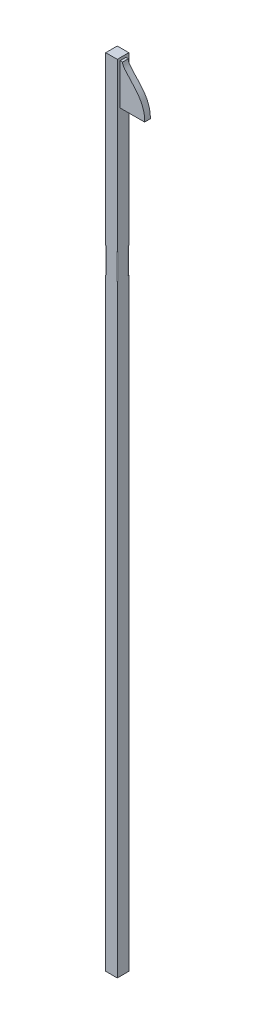
ISO-10303-21;
HEADER;
FILE_DESCRIPTION(('STEP AP214'),'2;1');
FILE_NAME('part.step','',(''),(''),'','','');
FILE_SCHEMA(('AUTOMOTIVE_DESIGN { 1 0 10303 214 1 1 1 1 }'));
ENDSEC;
DATA;
#1=APPLICATION_CONTEXT('core data for automotive mechanical design processes');
#2=APPLICATION_PROTOCOL_DEFINITION('international standard','automotive_design',2000,#1);
#3=PRODUCT_CONTEXT('',#1,'mechanical');
#4=PRODUCT('Part','Part','',(#3));
#5=PRODUCT_RELATED_PRODUCT_CATEGORY('part','',(#4));
#6=PRODUCT_DEFINITION_FORMATION('','',#4);
#7=PRODUCT_DEFINITION_CONTEXT('part definition',#1,'design');
#8=PRODUCT_DEFINITION('design','',#6,#7);
#9=PRODUCT_DEFINITION_SHAPE('','',#8);
#10=(LENGTH_UNIT() NAMED_UNIT(*) SI_UNIT(.MILLI.,.METRE.));
#11=(NAMED_UNIT(*) PLANE_ANGLE_UNIT() SI_UNIT($,.RADIAN.));
#12=(NAMED_UNIT(*) SI_UNIT($,.STERADIAN.) SOLID_ANGLE_UNIT());
#13=UNCERTAINTY_MEASURE_WITH_UNIT(LENGTH_MEASURE(1.E-05),#10,'distance_accuracy_value','');
#14=(GEOMETRIC_REPRESENTATION_CONTEXT(3) GLOBAL_UNCERTAINTY_ASSIGNED_CONTEXT((#13)) GLOBAL_UNIT_ASSIGNED_CONTEXT((#10,
#11,#12)) REPRESENTATION_CONTEXT('',''));
#15=CARTESIAN_POINT('',(0.,0.,0.));
#16=DIRECTION('',(0.,0.,1.));
#17=DIRECTION('',(1.,0.,0.));
#18=AXIS2_PLACEMENT_3D('',#15,#16,#17);
#19=CARTESIAN_POINT('',(0.85,2.9,0.110173502610086));
#20=DIRECTION('',(0.,0.,1.));
#21=DIRECTION('',(1.,0.,0.));
#22=AXIS2_PLACEMENT_3D('',#19,#20,#21);
#23=PLANE('',#22);
#24=DIRECTION('',(0.,1.,0.));
#25=VECTOR('',#24,1.);
#26=CARTESIAN_POINT('',(-0.85,2.9,0.110173502610086));
#27=LINE('',#26,#25);
#28=CARTESIAN_POINT('',(-0.85,2.9,0.110173502610086));
#29=VERTEX_POINT('',#28);
#30=CARTESIAN_POINT('',(-0.85,1.3,0.110173502610086));
#31=VERTEX_POINT('',#30);
#32=EDGE_CURVE('E374',#29,#31,#27,.F.);
#33=ORIENTED_EDGE('',*,*,#32,.T.);
#34=DIRECTION('',(1.,0.,0.));
#35=VECTOR('',#34,1.);
#36=CARTESIAN_POINT('',(0.85,1.3,0.110173502610086));
#37=LINE('',#36,#35);
#38=CARTESIAN_POINT('',(0.100899125819202,1.3,0.110173502610086));
#39=VERTEX_POINT('',#38);
#40=EDGE_CURVE('E120',#31,#39,#37,.T.);
#41=ORIENTED_EDGE('',*,*,#40,.T.);
#42=CARTESIAN_POINT('',(0.100899125819202,1.3,0.110173502610086));
#43=CARTESIAN_POINT('',(0.102305388720881,1.33336664785438,0.110173502610086));
#44=CARTESIAN_POINT('',(0.102418694779131,1.36680886901703,0.110173502610086));
#45=CARTESIAN_POINT('',(0.0999441349723264,1.43359452577916,0.110173502610086));
#46=CARTESIAN_POINT('',(0.0973560285746366,1.46693795231688,0.110173502610086));
#47=CARTESIAN_POINT('',(0.0913625702794557,1.51667671783272,0.110173502610086));
#48=CARTESIAN_POINT('',(0.0890139267344011,1.53320514328243,0.110173502610086));
#49=CARTESIAN_POINT('',(0.0808969176944397,1.58264962736257,0.110173502610086));
#50=CARTESIAN_POINT('',(0.0740592947542509,1.61540116301702,0.110173502610086));
#51=CARTESIAN_POINT('',(0.0616944121890046,1.6639567306135,0.110173502610086));
#52=CARTESIAN_POINT('',(0.0572233174207547,1.68004107962327,0.110173502610086));
#53=CARTESIAN_POINT('',(0.0427627455997351,1.7280129461602,0.110173502610086));
#54=CARTESIAN_POINT('',(0.0317306476339805,1.75959698698543,0.110173502610086));
#55=CARTESIAN_POINT('',(0.0132529566494027,1.80616996195067,0.110173502610086));
#56=CARTESIAN_POINT('',(0.00677475626660361,1.82155516242638,0.110173502610086));
#57=CARTESIAN_POINT('',(-0.0135926990462641,1.86732464783749,0.110173502610086));
#58=CARTESIAN_POINT('',(-0.0284086316945955,1.8973052543125,0.110173502610086));
#59=CARTESIAN_POINT('',(-0.0522417618238263,1.94137092062321,0.110173502610086));
#60=CARTESIAN_POINT('',(-0.0604516146934541,1.95590433872499,0.110173502610086));
#61=CARTESIAN_POINT('',(-0.0858380552811515,1.99908035238795,0.110173502610086));
#62=CARTESIAN_POINT('',(-0.103765796694549,2.02728721213659,0.110173502610086));
#63=CARTESIAN_POINT('',(-0.131879912365411,2.06874054639115,0.110173502610086));
#64=CARTESIAN_POINT('',(-0.141452782521934,2.08241256939298,0.110173502610086));
#65=CARTESIAN_POINT('',(-0.170727458499587,2.12304017394233,0.110173502610086));
#66=CARTESIAN_POINT('',(-0.190981428902999,2.14960120830227,0.110173502610086));
#67=CARTESIAN_POINT('',(-0.222203736617376,2.18875351332272,0.110173502610086));
#68=CARTESIAN_POINT('',(-0.232749937926459,2.20168773121554,0.110173502610086));
#69=CARTESIAN_POINT('',(-0.264756841972034,2.24018966679057,0.110173502610086));
#70=CARTESIAN_POINT('',(-0.2865839325908,2.26545417980147,0.110173502610086));
#71=CARTESIAN_POINT('',(-0.319829475260694,2.30289299860136,0.110173502610086));
#72=CARTESIAN_POINT('',(-0.330994744375275,2.31529550188057,0.110173502610086));
#73=CARTESIAN_POINT('',(-0.364693407076319,2.35231949580681,0.110173502610086));
#74=CARTESIAN_POINT('',(-0.387429210186716,2.3767569586789,0.110173502610086));
#75=CARTESIAN_POINT('',(-0.421717662040299,2.4132360151299,0.110173502610086));
#76=CARTESIAN_POINT('',(-0.433177714835523,2.42536594587241,0.110173502610086));
#77=CARTESIAN_POINT('',(-0.467593817594204,2.4617219218368,0.110173502610086));
#78=CARTESIAN_POINT('',(-0.490585853825393,2.48591419540268,0.110173502610086));
#79=CARTESIAN_POINT('',(-0.524858734691096,2.52240557150338,0.110173502610086));
#80=CARTESIAN_POINT('',(-0.536247207118072,2.53460323591972,0.110173502610086));
#81=CARTESIAN_POINT('',(-0.558887523112638,2.55912550072514,0.110173502610086));
#82=CARTESIAN_POINT('',(-0.570139364694187,2.57145010295456,0.110173502610086));
#83=CARTESIAN_POINT('',(-0.59242639833595,2.59629527103212,0.110173502610086));
#84=CARTESIAN_POINT('',(-0.603461584018732,2.60881584262933,0.110173502610086));
#85=CARTESIAN_POINT('',(-0.625206388318713,2.6341395070912,0.110173502610086));
#86=CARTESIAN_POINT('',(-0.635915987967142,2.64694261634189,0.110173502610086));
#87=CARTESIAN_POINT('',(-0.656855022983628,2.67294201586249,0.110173502610086));
#88=CARTESIAN_POINT('',(-0.66708440131718,2.68613835253214,0.110173502610086));
#89=CARTESIAN_POINT('',(-0.686194204559783,2.71221239443918,0.110173502610086));
#90=CARTESIAN_POINT('',(-0.695119038562995,2.72505717687144,0.110173502610086));
#91=CARTESIAN_POINT('',(-0.711994978172597,2.75135000389626,0.110173502610086));
#92=CARTESIAN_POINT('',(-0.719947905027828,2.76479685357322,0.110173502610086));
#93=CARTESIAN_POINT('',(-0.733093287295084,2.79016469910344,0.110173502610086));
#94=CARTESIAN_POINT('',(-0.738525174385424,2.801956944667,0.110173502610086));
#95=CARTESIAN_POINT('',(-0.746558467960461,2.82320508808608,0.110173502610086));
#96=CARTESIAN_POINT('',(-0.749527609011546,2.83251863412376,0.110173502610086));
#97=CARTESIAN_POINT('',(-0.75403889188897,2.85146190462698,0.110173502610086));
#98=CARTESIAN_POINT('',(-0.755589637744402,2.86108935081317,0.110173502610086));
#99=CARTESIAN_POINT('',(-0.756386936933705,2.87564412215255,0.110173502610086));
#100=CARTESIAN_POINT('',(-0.756395916592759,2.88052748207427,0.110173502610086));
#101=CARTESIAN_POINT('',(-0.755812315266143,2.89029191549379,0.110173502610086));
#102=CARTESIAN_POINT('',(-0.755215362109504,2.89517271447045,0.110173502610086));
#103=CARTESIAN_POINT('',(-0.754271379437274,2.9,0.110173502610086));
#104=B_SPLINE_CURVE_WITH_KNOTS('',3,(#42,#43,#44,#45,#46,#47,#48,#49,#50,#51,#52,#53,#54,#55,
#56,#57,#58,#59,#60,#61,#62,#63,#64,#65,#66,#67,#68,#69,#70,#71,#72,#73,#74,#75,#76,#77,#78,#79,
#80,#81,#82,#83,#84,#85,#86,#87,#88,#89,#90,#91,#92,#93,#94,#95,#96,#97,#98,#99,#100,#101,#102,
#103),.UNSPECIFIED.,.F.,.F.,(4,2,2,2,2,2,2,2,2,2,2,2,2,2,2,2,2,2,2,2,2,2,2,2,2,2,2,2,2,2,4),(0.,
0.100200608489576,0.200410139560578,0.250483749098557,0.350702153848327,0.400776181940032,
0.500992367302773,0.551065205368039,0.651266580602867,0.701336957582731,0.801516162637446,
0.851583622993298,0.951740194370672,1.00180515193273,1.10194447148951,1.15200773379046,
1.25213629434438,1.30219864751873,1.40232317027707,1.45238579602033,1.50244914859546,
1.55251397262122,1.6025817078754,1.65265537456417,1.69955139429332,1.7463581427431,
1.78521494818375,1.81447416063349,1.84355468538391,1.85817109277964,1.87289372138671),.UNSPECIFIED.);
#105=CARTESIAN_POINT('',(-0.754271379437274,2.9,0.110173502610086));
#106=VERTEX_POINT('',#105);
#107=EDGE_CURVE('E24',#39,#106,#104,.T.);
#108=ORIENTED_EDGE('',*,*,#107,.T.);
#109=DIRECTION('',(1.,0.,0.));
#110=VECTOR('',#109,1.);
#111=CARTESIAN_POINT('',(0.85,2.9,0.110173502610086));
#112=LINE('',#111,#110);
#113=EDGE_CURVE('E377',#106,#29,#112,.F.);
#114=ORIENTED_EDGE('',*,*,#113,.T.);
#115=EDGE_LOOP('',(#33,#41,#108,#114));
#116=FACE_BOUND('',#115,.T.);
#117=ADVANCED_FACE('F17',(#116),#23,.T.);
#118=CARTESIAN_POINT('',(0.100899125819202,1.3,0.110173502610086));
#119=CARTESIAN_POINT('',(0.100899125819202,1.3,-0.258517350261009));
#120=CARTESIAN_POINT('',(0.102161316913395,1.33018182743931,0.110173502610086));
#121=CARTESIAN_POINT('',(0.102161316913395,1.33018182743931,-0.258517350261009));
#122=CARTESIAN_POINT('',(0.102928931664183,1.39013939139415,0.110173502610086));
#123=CARTESIAN_POINT('',(0.102928931664183,1.39013939139415,-0.258517350261009));
#124=CARTESIAN_POINT('',(0.0988101809346095,1.47885746966527,0.110173502610086));
#125=CARTESIAN_POINT('',(0.0988101809346095,1.47885746966527,-0.258517350261009));
#126=CARTESIAN_POINT('',(0.0827004100197384,1.59469395369209,0.110173502610086));
#127=CARTESIAN_POINT('',(0.0827004100197384,1.59469395369209,-0.258517350261009));
#128=CARTESIAN_POINT('',(0.0446474719014038,1.7352418345057,0.110173502610086));
#129=CARTESIAN_POINT('',(0.0446474719014038,1.7352418345057,-0.258517350261009));
#130=CARTESIAN_POINT('',(-0.0111822678173812,1.87125590361862,0.110173502610086));
#131=CARTESIAN_POINT('',(-0.0111822678173812,1.87125590361862,-0.258517350261009));
#132=CARTESIAN_POINT('',(-0.083811744606569,2.00231200075987,0.110173502610086));
#133=CARTESIAN_POINT('',(-0.083811744606569,2.00231200075987,-0.258517350261009));
#134=CARTESIAN_POINT('',(-0.170985439766142,2.1278493463251,0.110173502610086));
#135=CARTESIAN_POINT('',(-0.170985439766142,2.1278493463251,-0.258517350261009));
#136=CARTESIAN_POINT('',(-0.268406549547145,2.24717531020337,0.110173502610086));
#137=CARTESIAN_POINT('',(-0.268406549547145,2.24717531020337,-0.258517350261009));
#138=CARTESIAN_POINT('',(-0.370218593172325,2.35951057822847,0.110173502610086));
#139=CARTESIAN_POINT('',(-0.370218593172325,2.35951057822847,-0.258517350261009));
#140=CARTESIAN_POINT('',(-0.469917194208403,2.46405442724653,0.110173502610086));
#141=CARTESIAN_POINT('',(-0.469917194208403,2.46405442724653,-0.258517350261009));
#142=CARTESIAN_POINT('',(-0.561118331093695,2.56007299012793,0.110173502610086));
#143=CARTESIAN_POINT('',(-0.561118331093695,2.56007299012793,-0.258517350261009));
#144=CARTESIAN_POINT('',(-0.638294458126951,2.64698716653611,0.110173502610086));
#145=CARTESIAN_POINT('',(-0.638294458126951,2.64698716653611,-0.258517350261009));
#146=CARTESIAN_POINT('',(-0.697785468714333,2.7245390714351,0.110173502610086));
#147=CARTESIAN_POINT('',(-0.697785468714333,2.7245390714351,-0.258517350261009));
#148=CARTESIAN_POINT('',(-0.737966519602591,2.79279596856583,0.110173502610086));
#149=CARTESIAN_POINT('',(-0.737966519602591,2.79279596856583,-0.258517350261009));
#150=CARTESIAN_POINT('',(-0.754283259268477,2.84011903002906,0.110173502610086));
#151=CARTESIAN_POINT('',(-0.754283259268477,2.84011903002906,-0.258517350261009));
#152=CARTESIAN_POINT('',(-0.757688052822413,2.87160599650294,0.110173502610086));
#153=CARTESIAN_POINT('',(-0.757688052822413,2.87160599650294,-0.258517350261009));
#154=CARTESIAN_POINT('',(-0.756059911881393,2.89082989636708,0.110173502610086));
#155=CARTESIAN_POINT('',(-0.756059911881393,2.89082989636708,-0.258517350261009));
#156=CARTESIAN_POINT('',(-0.754271379437274,2.9,0.110173502610086));
#157=CARTESIAN_POINT('',(-0.754271379437274,2.9,-0.258517350261009));
#158=B_SPLINE_SURFACE_WITH_KNOTS('',5,1,((#118,#119),(#120,#121),(#122,#123),(#124,#125),(#126,
#127),(#128,#129),(#130,#131),(#132,#133),(#134,#135),(#136,#137),(#138,#139),(#140,#141),(#142,
#143),(#144,#145),(#146,#147),(#148,#149),(#150,#151),(#152,#153),(#154,#155),(#156,#157)),
.UNSPECIFIED.,.F.,.F.,.F.,(6,1,1,1,1,1,1,1,1,1,1,1,1,1,1,6),(2,2),(-1.,-0.933333333333333,
-0.866666666666667,-0.8,-0.733333333333333,-0.666666666666667,-0.6,-0.533333333333333,
-0.466666666666667,-0.4,-0.333333333333333,-0.266666666666667,-0.2,-0.133333333333333,
-0.0666666666666667,0.),(0.,0.0368690852871095),.UNSPECIFIED.);
#159=DIRECTION('',(0.,0.,1.));
#160=VECTOR('',#159,1.);
#161=CARTESIAN_POINT('',(-0.754271379437274,2.9,0.));
#162=LINE('',#161,#160);
#163=CARTESIAN_POINT('',(-0.754271379437274,2.9,-0.110173502610086));
#164=VERTEX_POINT('',#163);
#165=EDGE_CURVE('E364',#106,#164,#162,.F.);
#166=DIRECTION('',(0.,0.,1.));
#167=VECTOR('',#166,1.);
#168=CARTESIAN_POINT('',(0.100899125819202,1.3,-0.0741719238254615));
#169=LINE('',#168,#167);
#170=CARTESIAN_POINT('',(0.100899125819202,1.3,-0.110173502610086));
#171=VERTEX_POINT('',#170);
#172=EDGE_CURVE('E116',#171,#39,#169,.T.);
#173=CARTESIAN_POINT('',(-0.754271379437274,2.9,-0.110173502610086));
#174=CARTESIAN_POINT('',(-0.755738562220202,2.89249173443631,-0.110173502610086));
#175=CARTESIAN_POINT('',(-0.756366435973199,2.88488995845058,-0.110173502610086));
#176=CARTESIAN_POINT('',(-0.75627458467291,2.86982331678855,-0.110173502610086));
#177=CARTESIAN_POINT('',(-0.755579157935418,2.86235847524754,-0.110173502610086));
#178=CARTESIAN_POINT('',(-0.752490191383573,2.84319344869217,-0.110173502610086));
#179=CARTESIAN_POINT('',(-0.749330105717283,2.83162869515541,-0.110173502610086));
#180=CARTESIAN_POINT('',(-0.741432861887619,2.80902446481223,-0.110173502610086));
#181=CARTESIAN_POINT('',(-0.736687055506086,2.79798825646503,-0.110173502610086));
#182=CARTESIAN_POINT('',(-0.726078596809697,2.77622931337648,-0.110173502610086));
#183=CARTESIAN_POINT('',(-0.720197254209045,2.76551589083944,-0.110173502610086));
#184=CARTESIAN_POINT('',(-0.707712476927154,2.74451411326866,-0.110173502610086));
#185=CARTESIAN_POINT('',(-0.70110840193879,2.73422614646908,-0.110173502610086));
#186=CARTESIAN_POINT('',(-0.680554513315993,2.70388605566598,-0.110173502610086));
#187=CARTESIAN_POINT('',(-0.665856340107139,2.68434538981179,-0.110173502610086));
#188=CARTESIAN_POINT('',(-0.635304375180131,2.64601183174423,-0.110173502610086));
#189=CARTESIAN_POINT('',(-0.619443712540409,2.62722460530892,-0.110173502610086));
#190=CARTESIAN_POINT('',(-0.587121618690929,2.59020852091149,-0.110173502610086));
#191=CARTESIAN_POINT('',(-0.570660770690057,2.57197915097567,-0.110173502610086));
#192=CARTESIAN_POINT('',(-0.521532015027294,2.51851242616434,-0.110173502610086));
#193=CARTESIAN_POINT('',(-0.488423139803536,2.48368622554896,-0.110173502610086));
#194=CARTESIAN_POINT('',(-0.42230482492221,2.41391066795704,-0.110173502610086));
#195=CARTESIAN_POINT('',(-0.389295437794886,2.37896126184945,-0.110173502610086));
#196=CARTESIAN_POINT('',(-0.324430453166217,2.30832589379311,-0.110173502610086));
#197=CARTESIAN_POINT('',(-0.292569779695282,2.27264466478911,-0.110173502610086));
#198=CARTESIAN_POINT('',(-0.230672337684236,2.19972823314143,-0.110173502610086));
#199=CARTESIAN_POINT('',(-0.20063494993332,2.16249356539609,-0.110173502610086));
#200=CARTESIAN_POINT('',(-0.14938369501497,2.09404372010623,-0.110173502610086));
#201=CARTESIAN_POINT('',(-0.12764789128393,2.06322250906079,-0.110173502610086));
#202=CARTESIAN_POINT('',(-0.0863951407376518,2.00011576844034,-0.110173502610086));
#203=CARTESIAN_POINT('',(-0.0668781722706048,1.96783025315858,-0.110173502610086));
#204=CARTESIAN_POINT('',(-0.0305901367360032,1.90180792510239,-0.110173502610086));
#205=CARTESIAN_POINT('',(-0.0138146490379295,1.8680735617875,-0.110173502610086));
#206=CARTESIAN_POINT('',(0.0165923227174184,1.79921883209672,-0.110173502610086));
#207=CARTESIAN_POINT('',(0.0302247606477213,1.76409889002458,-0.110173502610086));
#208=CARTESIAN_POINT('',(0.0535111150029728,1.69427168287703,-0.110173502610086));
#209=CARTESIAN_POINT('',(0.0633134166073864,1.65961398541499,-0.110173502610086));
#210=CARTESIAN_POINT('',(0.0796278683591426,1.58952107377571,-0.110173502610086));
#211=CARTESIAN_POINT('',(0.0861390368587591,1.55408563090456,-0.110173502610086));
#212=CARTESIAN_POINT('',(0.0959398717285155,1.48226567132045,-0.110173502610086));
#213=CARTESIAN_POINT('',(0.0991825451503164,1.44587482187644,-0.110173502610086));
#214=CARTESIAN_POINT('',(0.102430114735557,1.3729621553975,-0.110173502610086));
#215=CARTESIAN_POINT('',(0.102436394494413,1.33644040100379,-0.110173502610086));
#216=CARTESIAN_POINT('',(0.100899125819202,1.3,-0.110173502610086));
#217=B_SPLINE_CURVE_WITH_KNOTS('',3,(#173,#174,#175,#176,#177,#178,#179,#180,#181,#182,#183,
#184,#185,#186,#187,#188,#189,#190,#191,#192,#193,#194,#195,#196,#197,#198,#199,#200,#201,#202,
#203,#204,#205,#206,#207,#208,#209,#210,#211,#212,#213,#214,#215,#216),.UNSPECIFIED.,.F.,.F.,(4,
2,2,2,2,2,2,2,2,2,2,2,2,2,2,2,2,2,2,2,2,4),(0.,0.0228046987879947,0.0451946964399197,
0.0809677534452651,0.116939183985038,0.153562845128505,0.19021921989779,0.263490047325081,
0.33723564661994,0.410911402160929,0.555063719281688,0.699282106709919,0.84275609492547,
0.986181081763543,1.09924961428031,1.21231704335847,1.32520031307129,1.43804927901276,
1.54594414873212,1.65387118133957,1.76332870899933,1.87273944227156),.UNSPECIFIED.);
#218=EDGE_CURVE('E319',#164,#171,#217,.T.);
#219=ORIENTED_EDGE('',*,*,#165,.F.);
#220=ORIENTED_EDGE('',*,*,#107,.F.);
#221=ORIENTED_EDGE('',*,*,#172,.F.);
#222=ORIENTED_EDGE('',*,*,#218,.F.);
#223=EDGE_LOOP('',(#219,#220,#221,#222));
#224=FACE_BOUND('',#223,.T.);
#225=ADVANCED_FACE('F19',(#224),#158,.F.);
#226=CARTESIAN_POINT('',(0.,-3.5,0.));
#227=DIRECTION('',(0.,-1.,0.));
#228=DIRECTION('',(0.,0.,-1.));
#229=AXIS2_PLACEMENT_3D('',#226,#227,#228);
#230=PLANE('',#229);
#231=DIRECTION('',(0.,0.,-1.));
#232=VECTOR('',#231,1.);
#233=CARTESIAN_POINT('',(-0.85,-3.5,0.225));
#234=LINE('',#233,#232);
#235=CARTESIAN_POINT('',(-0.85,-3.5,0.225));
#236=VERTEX_POINT('',#235);
#237=CARTESIAN_POINT('',(-0.85,-3.5,0.2));
#238=VERTEX_POINT('',#237);
#239=EDGE_CURVE('E336',#236,#238,#234,.T.);
#240=ORIENTED_EDGE('',*,*,#239,.F.);
#241=DIRECTION('',(1.,0.,0.));
#242=VECTOR('',#241,1.);
#243=CARTESIAN_POINT('',(-1.3,-3.5,0.225));
#244=LINE('',#243,#242);
#245=CARTESIAN_POINT('',(-0.875,-3.5,0.225));
#246=VERTEX_POINT('',#245);
#247=EDGE_CURVE('E304',#246,#236,#244,.T.);
#248=ORIENTED_EDGE('',*,*,#247,.F.);
#249=CARTESIAN_POINT('',(-0.875,-3.5,0.2));
#250=DIRECTION('',(0.,-1.,0.));
#251=DIRECTION('',(0.,0.,-1.));
#252=AXIS2_PLACEMENT_3D('',#249,#250,#251);
#253=CIRCLE('',#252,0.025);
#254=EDGE_CURVE('E504',#238,#246,#253,.T.);
#255=ORIENTED_EDGE('',*,*,#254,.F.);
#256=EDGE_LOOP('',(#240,#248,#255));
#257=FACE_BOUND('',#256,.T.);
#258=ADVANCED_FACE('F422',(#257),#230,.T.);
#259=CARTESIAN_POINT('',(-0.875,0.,0.2));
#260=DIRECTION('',(0.,-1.,0.));
#261=DIRECTION('',(0.,0.,-1.));
#262=AXIS2_PLACEMENT_3D('',#259,#260,#261);
#263=CYLINDRICAL_SURFACE('',#262,0.025);
#264=ORIENTED_EDGE('',*,*,#254,.T.);
#265=DIRECTION('',(0.,1.,0.));
#266=VECTOR('',#265,1.);
#267=CARTESIAN_POINT('',(-0.875,0.,0.225));
#268=LINE('',#267,#266);
#269=CARTESIAN_POINT('',(-0.875,-4.5,0.225));
#270=VERTEX_POINT('',#269);
#271=EDGE_CURVE('E273',#270,#246,#268,.T.);
#272=ORIENTED_EDGE('',*,*,#271,.F.);
#273=CARTESIAN_POINT('',(-0.875,-4.5,0.2));
#274=DIRECTION('',(0.,-1.,0.));
#275=DIRECTION('',(0.,0.,-1.));
#276=AXIS2_PLACEMENT_3D('',#273,#274,#275);
#277=CIRCLE('',#276,0.025);
#278=CARTESIAN_POINT('',(-0.85,-4.5,0.2));
#279=VERTEX_POINT('',#278);
#280=EDGE_CURVE('E367',#270,#279,#277,.F.);
#281=ORIENTED_EDGE('',*,*,#280,.T.);
#282=DIRECTION('',(0.,1.,0.));
#283=VECTOR('',#282,1.);
#284=CARTESIAN_POINT('',(-0.85,0.,0.2));
#285=LINE('',#284,#283);
#286=EDGE_CURVE('E331',#238,#279,#285,.F.);
#287=ORIENTED_EDGE('',*,*,#286,.F.);
#288=EDGE_LOOP('',(#264,#272,#281,#287));
#289=FACE_BOUND('',#288,.T.);
#290=ADVANCED_FACE('F418',(#289),#263,.T.);
#291=CARTESIAN_POINT('',(0.,-4.5,0.));
#292=DIRECTION('',(0.,-1.,0.));
#293=DIRECTION('',(0.,0.,-1.));
#294=AXIS2_PLACEMENT_3D('',#291,#292,#293);
#295=PLANE('',#294);
#296=DIRECTION('',(1.,0.,0.));
#297=VECTOR('',#296,1.);
#298=CARTESIAN_POINT('',(-1.3,-4.5,0.225));
#299=LINE('',#298,#297);
#300=CARTESIAN_POINT('',(-0.85,-4.5,0.225));
#301=VERTEX_POINT('',#300);
#302=EDGE_CURVE('E303',#301,#270,#299,.F.);
#303=ORIENTED_EDGE('',*,*,#302,.F.);
#304=DIRECTION('',(0.,0.,-1.));
#305=VECTOR('',#304,1.);
#306=CARTESIAN_POINT('',(-0.85,-4.5,0.225));
#307=LINE('',#306,#305);
#308=EDGE_CURVE('E312',#279,#301,#307,.F.);
#309=ORIENTED_EDGE('',*,*,#308,.F.);
#310=ORIENTED_EDGE('',*,*,#280,.F.);
#311=EDGE_LOOP('',(#303,#309,#310));
#312=FACE_BOUND('',#311,.T.);
#313=ADVANCED_FACE('F414',(#312),#295,.F.);
#314=CARTESIAN_POINT('',(0.,2.9,0.));
#315=DIRECTION('',(0.,1.,0.));
#316=DIRECTION('',(0.,0.,1.));
#317=AXIS2_PLACEMENT_3D('',#314,#315,#316);
#318=PLANE('',#317);
#319=DIRECTION('',(0.,0.,-1.));
#320=VECTOR('',#319,1.);
#321=CARTESIAN_POINT('',(-0.85,2.9,0.225));
#322=LINE('',#321,#320);
#323=CARTESIAN_POINT('',(-0.85,2.9,-0.110173502610086));
#324=VERTEX_POINT('',#323);
#325=EDGE_CURVE('E324',#29,#324,#322,.T.);
#326=ORIENTED_EDGE('',*,*,#325,.F.);
#327=ORIENTED_EDGE('',*,*,#113,.F.);
#328=ORIENTED_EDGE('',*,*,#165,.T.);
#329=DIRECTION('',(-1.,0.,0.));
#330=VECTOR('',#329,1.);
#331=CARTESIAN_POINT('',(-0.85,2.9,-0.110173502610086));
#332=LINE('',#331,#330);
#333=EDGE_CURVE('E315',#324,#164,#332,.F.);
#334=ORIENTED_EDGE('',*,*,#333,.F.);
#335=EDGE_LOOP('',(#326,#327,#328,#334));
#336=FACE_BOUND('',#335,.T.);
#337=ADVANCED_FACE('F409',(#336),#318,.T.);
#338=CARTESIAN_POINT('',(-0.85,2.9,-0.110173502610086));
#339=DIRECTION('',(0.,0.,-1.));
#340=DIRECTION('',(-1.,0.,0.));
#341=AXIS2_PLACEMENT_3D('',#338,#339,#340);
#342=PLANE('',#341);
#343=DIRECTION('',(0.,1.,0.));
#344=VECTOR('',#343,1.);
#345=CARTESIAN_POINT('',(-0.85,0.,-0.110173502610086));
#346=LINE('',#345,#344);
#347=CARTESIAN_POINT('',(-0.85,1.3,-0.110173502610086));
#348=VERTEX_POINT('',#347);
#349=EDGE_CURVE('E357',#324,#348,#346,.F.);
#350=ORIENTED_EDGE('',*,*,#349,.F.);
#351=ORIENTED_EDGE('',*,*,#333,.T.);
#352=ORIENTED_EDGE('',*,*,#218,.T.);
#353=DIRECTION('',(1.,0.,0.));
#354=VECTOR('',#353,1.);
#355=CARTESIAN_POINT('',(0.,1.3,-0.110173502610086));
#356=LINE('',#355,#354);
#357=EDGE_CURVE('E318',#348,#171,#356,.T.);
#358=ORIENTED_EDGE('',*,*,#357,.F.);
#359=EDGE_LOOP('',(#350,#351,#352,#358));
#360=FACE_BOUND('',#359,.T.);
#361=ADVANCED_FACE('F403',(#360),#342,.T.);
#362=CARTESIAN_POINT('',(0.,1.3,0.));
#363=DIRECTION('',(0.,-1.,0.));
#364=DIRECTION('',(0.,0.,-1.));
#365=AXIS2_PLACEMENT_3D('',#362,#363,#364);
#366=PLANE('',#365);
#367=DIRECTION('',(0.,0.,-1.));
#368=VECTOR('',#367,1.);
#369=CARTESIAN_POINT('',(-0.85,1.3,0.225));
#370=LINE('',#369,#368);
#371=EDGE_CURVE('E204',#348,#31,#370,.F.);
#372=ORIENTED_EDGE('',*,*,#371,.F.);
#373=ORIENTED_EDGE('',*,*,#357,.T.);
#374=ORIENTED_EDGE('',*,*,#172,.T.);
#375=ORIENTED_EDGE('',*,*,#40,.F.);
#376=EDGE_LOOP('',(#372,#373,#374,#375));
#377=FACE_BOUND('',#376,.T.);
#378=ADVANCED_FACE('F408',(#377),#366,.T.);
#379=CARTESIAN_POINT('',(0.,-3.5,0.));
#380=DIRECTION('',(0.,-1.,0.));
#381=DIRECTION('',(0.,0.,-1.));
#382=AXIS2_PLACEMENT_3D('',#379,#380,#381);
#383=PLANE('',#382);
#384=DIRECTION('',(1.,0.,0.));
#385=VECTOR('',#384,1.);
#386=CARTESIAN_POINT('',(-1.3,-3.5,0.225));
#387=LINE('',#386,#385);
#388=CARTESIAN_POINT('',(-1.3,-3.5,0.225));
#389=VERTEX_POINT('',#388);
#390=CARTESIAN_POINT('',(-1.275,-3.5,0.225));
#391=VERTEX_POINT('',#390);
#392=EDGE_CURVE('E300',#389,#391,#387,.T.);
#393=ORIENTED_EDGE('',*,*,#392,.F.);
#394=DIRECTION('',(0.,0.,1.));
#395=VECTOR('',#394,1.);
#396=CARTESIAN_POINT('',(-1.3,-3.5,-0.225));
#397=LINE('',#396,#395);
#398=CARTESIAN_POINT('',(-1.3,-3.5,0.2));
#399=VERTEX_POINT('',#398);
#400=EDGE_CURVE('E287',#399,#389,#397,.T.);
#401=ORIENTED_EDGE('',*,*,#400,.F.);
#402=CARTESIAN_POINT('',(-1.275,-3.5,0.2));
#403=DIRECTION('',(0.,1.,0.));
#404=DIRECTION('',(0.,0.,1.));
#405=AXIS2_PLACEMENT_3D('',#402,#403,#404);
#406=CIRCLE('',#405,0.025);
#407=EDGE_CURVE('E272',#391,#399,#406,.F.);
#408=ORIENTED_EDGE('',*,*,#407,.F.);
#409=EDGE_LOOP('',(#393,#401,#408));
#410=FACE_BOUND('',#409,.T.);
#411=ADVANCED_FACE('F484',(#410),#383,.T.);
#412=CARTESIAN_POINT('',(-1.3,0.,0.225));
#413=DIRECTION('',(0.,0.,1.));
#414=DIRECTION('',(1.,0.,0.));
#415=AXIS2_PLACEMENT_3D('',#412,#413,#414);
#416=PLANE('',#415);
#417=ORIENTED_EDGE('',*,*,#302,.T.);
#418=ORIENTED_EDGE('',*,*,#271,.T.);
#419=ORIENTED_EDGE('',*,*,#247,.T.);
#420=DIRECTION('',(0.,1.,0.));
#421=VECTOR('',#420,1.);
#422=CARTESIAN_POINT('',(-0.85,0.,0.225));
#423=LINE('',#422,#421);
#424=CARTESIAN_POINT('',(-0.85,3.,0.225));
#425=VERTEX_POINT('',#424);
#426=EDGE_CURVE('E241',#425,#236,#423,.F.);
#427=ORIENTED_EDGE('',*,*,#426,.F.);
#428=DIRECTION('',(1.,0.,0.));
#429=VECTOR('',#428,1.);
#430=CARTESIAN_POINT('',(-1.075,3.,0.225));
#431=LINE('',#430,#429);
#432=CARTESIAN_POINT('',(-1.3,3.,0.225));
#433=VERTEX_POINT('',#432);
#434=EDGE_CURVE('E290',#433,#425,#431,.T.);
#435=ORIENTED_EDGE('',*,*,#434,.F.);
#436=DIRECTION('',(0.,1.,0.));
#437=VECTOR('',#436,1.);
#438=CARTESIAN_POINT('',(-1.3,0.,0.225));
#439=LINE('',#438,#437);
#440=EDGE_CURVE('E256',#389,#433,#439,.T.);
#441=ORIENTED_EDGE('',*,*,#440,.F.);
#442=ORIENTED_EDGE('',*,*,#392,.T.);
#443=DIRECTION('',(0.,1.,0.));
#444=VECTOR('',#443,1.);
#445=CARTESIAN_POINT('',(-1.275,0.,0.225));
#446=LINE('',#445,#444);
#447=CARTESIAN_POINT('',(-1.275,-4.5,0.225));
#448=VERTEX_POINT('',#447);
#449=EDGE_CURVE('E293',#448,#391,#446,.T.);
#450=ORIENTED_EDGE('',*,*,#449,.F.);
#451=DIRECTION('',(1.,0.,0.));
#452=VECTOR('',#451,1.);
#453=CARTESIAN_POINT('',(0.,-4.5,0.225));
#454=LINE('',#453,#452);
#455=CARTESIAN_POINT('',(-1.3,-4.5,0.225));
#456=VERTEX_POINT('',#455);
#457=EDGE_CURVE('E270',#448,#456,#454,.F.);
#458=ORIENTED_EDGE('',*,*,#457,.T.);
#459=DIRECTION('',(0.,1.,0.));
#460=VECTOR('',#459,1.);
#461=CARTESIAN_POINT('',(-1.3,0.,0.225));
#462=LINE('',#461,#460);
#463=CARTESIAN_POINT('',(-1.3,-28.,0.225));
#464=VERTEX_POINT('',#463);
#465=EDGE_CURVE('E178',#464,#456,#462,.T.);
#466=ORIENTED_EDGE('',*,*,#465,.F.);
#467=DIRECTION('',(1.,0.,0.));
#468=VECTOR('',#467,1.);
#469=CARTESIAN_POINT('',(-1.075,-28.,0.225));
#470=LINE('',#469,#468);
#471=CARTESIAN_POINT('',(-0.85,-28.,0.225));
#472=VERTEX_POINT('',#471);
#473=EDGE_CURVE('E174',#472,#464,#470,.F.);
#474=ORIENTED_EDGE('',*,*,#473,.F.);
#475=DIRECTION('',(0.,1.,0.));
#476=VECTOR('',#475,1.);
#477=CARTESIAN_POINT('',(-0.85,0.,0.225));
#478=LINE('',#477,#476);
#479=EDGE_CURVE('E213',#301,#472,#478,.F.);
#480=ORIENTED_EDGE('',*,*,#479,.F.);
#481=EDGE_LOOP('',(#417,#418,#419,#427,#435,#441,#442,#450,#458,#466,#474,#480));
#482=FACE_BOUND('',#481,.T.);
#483=ADVANCED_FACE('F481',(#482),#416,.T.);
#484=CARTESIAN_POINT('',(0.,-4.5,0.));
#485=DIRECTION('',(0.,-1.,0.));
#486=DIRECTION('',(0.,0.,-1.));
#487=AXIS2_PLACEMENT_3D('',#484,#485,#486);
#488=PLANE('',#487);
#489=DIRECTION('',(0.,0.,1.));
#490=VECTOR('',#489,1.);
#491=CARTESIAN_POINT('',(-1.3,-4.5,-0.225));
#492=LINE('',#491,#490);
#493=CARTESIAN_POINT('',(-1.3,-4.5,0.2));
#494=VERTEX_POINT('',#493);
#495=EDGE_CURVE('E279',#456,#494,#492,.F.);
#496=ORIENTED_EDGE('',*,*,#495,.F.);
#497=ORIENTED_EDGE('',*,*,#457,.F.);
#498=CARTESIAN_POINT('',(-1.275,-4.5,0.2));
#499=DIRECTION('',(0.,1.,0.));
#500=DIRECTION('',(0.,0.,1.));
#501=AXIS2_PLACEMENT_3D('',#498,#499,#500);
#502=CIRCLE('',#501,0.025);
#503=EDGE_CURVE('E350',#494,#448,#502,.T.);
#504=ORIENTED_EDGE('',*,*,#503,.F.);
#505=EDGE_LOOP('',(#496,#497,#504));
#506=FACE_BOUND('',#505,.T.);
#507=ADVANCED_FACE('F477',(#506),#488,.F.);
#508=CARTESIAN_POINT('',(-1.275,0.,0.2));
#509=DIRECTION('',(0.,1.,0.));
#510=DIRECTION('',(0.,0.,1.));
#511=AXIS2_PLACEMENT_3D('',#508,#509,#510);
#512=CYLINDRICAL_SURFACE('',#511,0.025);
#513=ORIENTED_EDGE('',*,*,#503,.T.);
#514=ORIENTED_EDGE('',*,*,#449,.T.);
#515=ORIENTED_EDGE('',*,*,#407,.T.);
#516=DIRECTION('',(0.,1.,0.));
#517=VECTOR('',#516,1.);
#518=CARTESIAN_POINT('',(-1.3,0.,0.2));
#519=LINE('',#518,#517);
#520=EDGE_CURVE('E276',#494,#399,#519,.T.);
#521=ORIENTED_EDGE('',*,*,#520,.F.);
#522=EDGE_LOOP('',(#513,#514,#515,#521));
#523=FACE_BOUND('',#522,.T.);
#524=ADVANCED_FACE('F473',(#523),#512,.T.);
#525=CARTESIAN_POINT('',(0.,-3.5,0.));
#526=DIRECTION('',(0.,-1.,0.));
#527=DIRECTION('',(0.,0.,-1.));
#528=AXIS2_PLACEMENT_3D('',#525,#526,#527);
#529=PLANE('',#528);
#530=DIRECTION('',(0.,0.,1.));
#531=VECTOR('',#530,1.);
#532=CARTESIAN_POINT('',(-1.3,-3.5,-0.225));
#533=LINE('',#532,#531);
#534=CARTESIAN_POINT('',(-1.3,-3.5,-0.225));
#535=VERTEX_POINT('',#534);
#536=CARTESIAN_POINT('',(-1.3,-3.5,-0.2));
#537=VERTEX_POINT('',#536);
#538=EDGE_CURVE('E179',#535,#537,#533,.T.);
#539=ORIENTED_EDGE('',*,*,#538,.F.);
#540=DIRECTION('',(-1.,0.,0.));
#541=VECTOR('',#540,1.);
#542=CARTESIAN_POINT('',(-0.85,-3.5,-0.225));
#543=LINE('',#542,#541);
#544=CARTESIAN_POINT('',(-1.275,-3.5,-0.225));
#545=VERTEX_POINT('',#544);
#546=EDGE_CURVE('E251',#545,#535,#543,.T.);
#547=ORIENTED_EDGE('',*,*,#546,.F.);
#548=CARTESIAN_POINT('',(-1.275,-3.5,-0.2));
#549=DIRECTION('',(0.,1.,0.));
#550=DIRECTION('',(0.,0.,1.));
#551=AXIS2_PLACEMENT_3D('',#548,#549,#550);
#552=CIRCLE('',#551,0.025);
#553=EDGE_CURVE('E387',#537,#545,#552,.F.);
#554=ORIENTED_EDGE('',*,*,#553,.F.);
#555=EDGE_LOOP('',(#539,#547,#554));
#556=FACE_BOUND('',#555,.T.);
#557=ADVANCED_FACE('F469',(#556),#529,.T.);
#558=CARTESIAN_POINT('',(-1.075,3.,0.));
#559=DIRECTION('',(0.,1.,0.));
#560=DIRECTION('',(0.,0.,1.));
#561=AXIS2_PLACEMENT_3D('',#558,#559,#560);
#562=PLANE('',#561);
#563=DIRECTION('',(0.,0.,1.));
#564=VECTOR('',#563,1.);
#565=CARTESIAN_POINT('',(-1.3,3.,-0.225));
#566=LINE('',#565,#564);
#567=CARTESIAN_POINT('',(-1.3,3.,-0.225));
#568=VERTEX_POINT('',#567);
#569=EDGE_CURVE('E254',#433,#568,#566,.F.);
#570=ORIENTED_EDGE('',*,*,#569,.F.);
#571=ORIENTED_EDGE('',*,*,#434,.T.);
#572=DIRECTION('',(0.,0.,-1.));
#573=VECTOR('',#572,1.);
#574=CARTESIAN_POINT('',(-0.85,3.,0.225));
#575=LINE('',#574,#573);
#576=CARTESIAN_POINT('',(-0.85,3.,-0.225));
#577=VERTEX_POINT('',#576);
#578=EDGE_CURVE('E235',#577,#425,#575,.F.);
#579=ORIENTED_EDGE('',*,*,#578,.F.);
#580=DIRECTION('',(-1.,0.,0.));
#581=VECTOR('',#580,1.);
#582=CARTESIAN_POINT('',(-0.85,3.,-0.225));
#583=LINE('',#582,#581);
#584=EDGE_CURVE('E230',#568,#577,#583,.F.);
#585=ORIENTED_EDGE('',*,*,#584,.F.);
#586=EDGE_LOOP('',(#570,#571,#579,#585));
#587=FACE_BOUND('',#586,.T.);
#588=ADVANCED_FACE('F465',(#587),#562,.T.);
#589=CARTESIAN_POINT('',(0.,-3.5,0.));
#590=DIRECTION('',(0.,-1.,0.));
#591=DIRECTION('',(0.,0.,-1.));
#592=AXIS2_PLACEMENT_3D('',#589,#590,#591);
#593=PLANE('',#592);
#594=DIRECTION('',(-1.,0.,0.));
#595=VECTOR('',#594,1.);
#596=CARTESIAN_POINT('',(-0.85,-3.5,-0.225));
#597=LINE('',#596,#595);
#598=CARTESIAN_POINT('',(-0.85,-3.5,-0.225));
#599=VERTEX_POINT('',#598);
#600=CARTESIAN_POINT('',(-0.875,-3.5,-0.225));
#601=VERTEX_POINT('',#600);
#602=EDGE_CURVE('E222',#599,#601,#597,.T.);
#603=ORIENTED_EDGE('',*,*,#602,.F.);
#604=DIRECTION('',(0.,0.,-1.));
#605=VECTOR('',#604,1.);
#606=CARTESIAN_POINT('',(-0.85,-3.5,0.225));
#607=LINE('',#606,#605);
#608=CARTESIAN_POINT('',(-0.85,-3.5,-0.2));
#609=VERTEX_POINT('',#608);
#610=EDGE_CURVE('E233',#609,#599,#607,.T.);
#611=ORIENTED_EDGE('',*,*,#610,.F.);
#612=CARTESIAN_POINT('',(-0.875,-3.5,-0.2));
#613=DIRECTION('',(0.,1.,0.));
#614=DIRECTION('',(0.,0.,1.));
#615=AXIS2_PLACEMENT_3D('',#612,#613,#614);
#616=CIRCLE('',#615,0.025);
#617=EDGE_CURVE('E292',#601,#609,#616,.F.);
#618=ORIENTED_EDGE('',*,*,#617,.F.);
#619=EDGE_LOOP('',(#603,#611,#618));
#620=FACE_BOUND('',#619,.T.);
#621=ADVANCED_FACE('F461',(#620),#593,.T.);
#622=CARTESIAN_POINT('',(-0.875,0.,-0.2));
#623=DIRECTION('',(0.,1.,0.));
#624=DIRECTION('',(0.,0.,1.));
#625=AXIS2_PLACEMENT_3D('',#622,#623,#624);
#626=CYLINDRICAL_SURFACE('',#625,0.025);
#627=CARTESIAN_POINT('',(-0.875,-4.5,-0.2));
#628=DIRECTION('',(0.,1.,0.));
#629=DIRECTION('',(0.,0.,1.));
#630=AXIS2_PLACEMENT_3D('',#627,#628,#629);
#631=CIRCLE('',#630,0.025);
#632=CARTESIAN_POINT('',(-0.85,-4.5,-0.2));
#633=VERTEX_POINT('',#632);
#634=CARTESIAN_POINT('',(-0.875,-4.5,-0.225));
#635=VERTEX_POINT('',#634);
#636=EDGE_CURVE('E236',#633,#635,#631,.T.);
#637=ORIENTED_EDGE('',*,*,#636,.T.);
#638=DIRECTION('',(0.,1.,0.));
#639=VECTOR('',#638,1.);
#640=CARTESIAN_POINT('',(-0.875,0.,-0.225));
#641=LINE('',#640,#639);
#642=EDGE_CURVE('E217',#601,#635,#641,.F.);
#643=ORIENTED_EDGE('',*,*,#642,.F.);
#644=ORIENTED_EDGE('',*,*,#617,.T.);
#645=DIRECTION('',(0.,1.,0.));
#646=VECTOR('',#645,1.);
#647=CARTESIAN_POINT('',(-0.85,0.,-0.2));
#648=LINE('',#647,#646);
#649=EDGE_CURVE('E212',#633,#609,#648,.T.);
#650=ORIENTED_EDGE('',*,*,#649,.F.);
#651=EDGE_LOOP('',(#637,#643,#644,#650));
#652=FACE_BOUND('',#651,.T.);
#653=ADVANCED_FACE('F457',(#652),#626,.T.);
#654=CARTESIAN_POINT('',(0.,-4.5,0.));
#655=DIRECTION('',(0.,-1.,0.));
#656=DIRECTION('',(0.,0.,-1.));
#657=AXIS2_PLACEMENT_3D('',#654,#655,#656);
#658=PLANE('',#657);
#659=DIRECTION('',(0.,0.,-1.));
#660=VECTOR('',#659,1.);
#661=CARTESIAN_POINT('',(-0.85,-4.5,0.225));
#662=LINE('',#661,#660);
#663=CARTESIAN_POINT('',(-0.85,-4.5,-0.225));
#664=VERTEX_POINT('',#663);
#665=EDGE_CURVE('E209',#664,#633,#662,.F.);
#666=ORIENTED_EDGE('',*,*,#665,.F.);
#667=DIRECTION('',(-1.,0.,0.));
#668=VECTOR('',#667,1.);
#669=CARTESIAN_POINT('',(-0.85,-4.5,-0.225));
#670=LINE('',#669,#668);
#671=EDGE_CURVE('E195',#635,#664,#670,.F.);
#672=ORIENTED_EDGE('',*,*,#671,.F.);
#673=ORIENTED_EDGE('',*,*,#636,.F.);
#674=EDGE_LOOP('',(#666,#672,#673));
#675=FACE_BOUND('',#674,.T.);
#676=ADVANCED_FACE('F453',(#675),#658,.F.);
#677=CARTESIAN_POINT('',(-0.85,0.,0.225));
#678=DIRECTION('',(1.,0.,0.));
#679=DIRECTION('',(0.,0.,-1.));
#680=AXIS2_PLACEMENT_3D('',#677,#678,#679);
#681=PLANE('',#680);
#682=ORIENTED_EDGE('',*,*,#349,.T.);
#683=ORIENTED_EDGE('',*,*,#371,.T.);
#684=ORIENTED_EDGE('',*,*,#32,.F.);
#685=ORIENTED_EDGE('',*,*,#325,.T.);
#686=EDGE_LOOP('',(#682,#683,#684,#685));
#687=FACE_BOUND('',#686,.T.);
#688=ORIENTED_EDGE('',*,*,#665,.T.);
#689=ORIENTED_EDGE('',*,*,#649,.T.);
#690=ORIENTED_EDGE('',*,*,#610,.T.);
#691=DIRECTION('',(0.,1.,0.));
#692=VECTOR('',#691,1.);
#693=CARTESIAN_POINT('',(-0.85,0.,-0.225));
#694=LINE('',#693,#692);
#695=EDGE_CURVE('E225',#577,#599,#694,.F.);
#696=ORIENTED_EDGE('',*,*,#695,.F.);
#697=ORIENTED_EDGE('',*,*,#578,.T.);
#698=ORIENTED_EDGE('',*,*,#426,.T.);
#699=ORIENTED_EDGE('',*,*,#239,.T.);
#700=ORIENTED_EDGE('',*,*,#286,.T.);
#701=ORIENTED_EDGE('',*,*,#308,.T.);
#702=ORIENTED_EDGE('',*,*,#479,.T.);
#703=DIRECTION('',(0.,0.,-1.));
#704=VECTOR('',#703,1.);
#705=CARTESIAN_POINT('',(-0.85,-28.,0.));
#706=LINE('',#705,#704);
#707=CARTESIAN_POINT('',(-0.85,-28.,-0.225));
#708=VERTEX_POINT('',#707);
#709=EDGE_CURVE('E202',#708,#472,#706,.F.);
#710=ORIENTED_EDGE('',*,*,#709,.F.);
#711=DIRECTION('',(0.,1.,0.));
#712=VECTOR('',#711,1.);
#713=CARTESIAN_POINT('',(-0.85,0.,-0.225));
#714=LINE('',#713,#712);
#715=EDGE_CURVE('E193',#664,#708,#714,.F.);
#716=ORIENTED_EDGE('',*,*,#715,.F.);
#717=EDGE_LOOP('',(#688,#689,#690,#696,#697,#698,#699,#700,#701,#702,#710,#716));
#718=FACE_BOUND('',#717,.T.);
#719=ADVANCED_FACE('F450',(#687,#718),#681,.T.);
#720=CARTESIAN_POINT('',(-1.075,-28.,0.));
#721=DIRECTION('',(0.,-1.,0.));
#722=DIRECTION('',(0.,0.,-1.));
#723=AXIS2_PLACEMENT_3D('',#720,#721,#722);
#724=PLANE('',#723);
#725=DIRECTION('',(0.,0.,1.));
#726=VECTOR('',#725,1.);
#727=CARTESIAN_POINT('',(-1.3,-28.,-0.225));
#728=LINE('',#727,#726);
#729=CARTESIAN_POINT('',(-1.3,-28.,-0.225));
#730=VERTEX_POINT('',#729);
#731=EDGE_CURVE('E166',#730,#464,#728,.T.);
#732=ORIENTED_EDGE('',*,*,#731,.F.);
#733=DIRECTION('',(-1.,0.,0.));
#734=VECTOR('',#733,1.);
#735=CARTESIAN_POINT('',(-0.85,-28.,-0.225));
#736=LINE('',#735,#734);
#737=EDGE_CURVE('E171',#708,#730,#736,.T.);
#738=ORIENTED_EDGE('',*,*,#737,.F.);
#739=ORIENTED_EDGE('',*,*,#709,.T.);
#740=ORIENTED_EDGE('',*,*,#473,.T.);
#741=EDGE_LOOP('',(#732,#738,#739,#740));
#742=FACE_BOUND('',#741,.T.);
#743=ADVANCED_FACE('F168',(#742),#724,.T.);
#744=CARTESIAN_POINT('',(-1.3,0.,-0.225));
#745=DIRECTION('',(-1.,0.,0.));
#746=DIRECTION('',(0.,0.,1.));
#747=AXIS2_PLACEMENT_3D('',#744,#745,#746);
#748=PLANE('',#747);
#749=ORIENTED_EDGE('',*,*,#495,.T.);
#750=ORIENTED_EDGE('',*,*,#520,.T.);
#751=ORIENTED_EDGE('',*,*,#400,.T.);
#752=ORIENTED_EDGE('',*,*,#440,.T.);
#753=ORIENTED_EDGE('',*,*,#569,.T.);
#754=DIRECTION('',(0.,1.,0.));
#755=VECTOR('',#754,1.);
#756=CARTESIAN_POINT('',(-1.3,0.,-0.225));
#757=LINE('',#756,#755);
#758=EDGE_CURVE('E246',#535,#568,#757,.T.);
#759=ORIENTED_EDGE('',*,*,#758,.F.);
#760=ORIENTED_EDGE('',*,*,#538,.T.);
#761=DIRECTION('',(0.,1.,0.));
#762=VECTOR('',#761,1.);
#763=CARTESIAN_POINT('',(-1.3,0.,-0.2));
#764=LINE('',#763,#762);
#765=CARTESIAN_POINT('',(-1.3,-4.5,-0.2));
#766=VERTEX_POINT('',#765);
#767=EDGE_CURVE('E265',#766,#537,#764,.T.);
#768=ORIENTED_EDGE('',*,*,#767,.F.);
#769=DIRECTION('',(0.,0.,-1.));
#770=VECTOR('',#769,1.);
#771=CARTESIAN_POINT('',(-1.3,-4.5,0.));
#772=LINE('',#771,#770);
#773=CARTESIAN_POINT('',(-1.3,-4.5,-0.225));
#774=VERTEX_POINT('',#773);
#775=EDGE_CURVE('E186',#766,#774,#772,.T.);
#776=ORIENTED_EDGE('',*,*,#775,.T.);
#777=DIRECTION('',(0.,1.,0.));
#778=VECTOR('',#777,1.);
#779=CARTESIAN_POINT('',(-1.3,0.,-0.225));
#780=LINE('',#779,#778);
#781=EDGE_CURVE('E182',#730,#774,#780,.T.);
#782=ORIENTED_EDGE('',*,*,#781,.F.);
#783=ORIENTED_EDGE('',*,*,#731,.T.);
#784=ORIENTED_EDGE('',*,*,#465,.T.);
#785=EDGE_LOOP('',(#749,#750,#751,#752,#753,#759,#760,#768,#776,#782,#783,#784));
#786=FACE_BOUND('',#785,.T.);
#787=ADVANCED_FACE('F184',(#786),#748,.T.);
#788=CARTESIAN_POINT('',(0.,-4.5,0.));
#789=DIRECTION('',(0.,-1.,0.));
#790=DIRECTION('',(0.,0.,-1.));
#791=AXIS2_PLACEMENT_3D('',#788,#789,#790);
#792=PLANE('',#791);
#793=DIRECTION('',(-1.,0.,0.));
#794=VECTOR('',#793,1.);
#795=CARTESIAN_POINT('',(-0.85,-4.5,-0.225));
#796=LINE('',#795,#794);
#797=CARTESIAN_POINT('',(-1.275,-4.5,-0.225));
#798=VERTEX_POINT('',#797);
#799=EDGE_CURVE('E33',#774,#798,#796,.F.);
#800=ORIENTED_EDGE('',*,*,#799,.F.);
#801=ORIENTED_EDGE('',*,*,#775,.F.);
#802=CARTESIAN_POINT('',(-1.275,-4.5,-0.2));
#803=DIRECTION('',(0.,1.,0.));
#804=DIRECTION('',(0.,0.,1.));
#805=AXIS2_PLACEMENT_3D('',#802,#803,#804);
#806=CIRCLE('',#805,0.025);
#807=EDGE_CURVE('E42',#798,#766,#806,.T.);
#808=ORIENTED_EDGE('',*,*,#807,.F.);
#809=EDGE_LOOP('',(#800,#801,#808));
#810=FACE_BOUND('',#809,.T.);
#811=ADVANCED_FACE('F440',(#810),#792,.F.);
#812=CARTESIAN_POINT('',(-1.275,0.,-0.2));
#813=DIRECTION('',(0.,1.,0.));
#814=DIRECTION('',(0.,0.,1.));
#815=AXIS2_PLACEMENT_3D('',#812,#813,#814);
#816=CYLINDRICAL_SURFACE('',#815,0.025);
#817=ORIENTED_EDGE('',*,*,#807,.T.);
#818=ORIENTED_EDGE('',*,*,#767,.T.);
#819=ORIENTED_EDGE('',*,*,#553,.T.);
#820=DIRECTION('',(0.,1.,0.));
#821=VECTOR('',#820,1.);
#822=CARTESIAN_POINT('',(-1.275,0.,-0.225));
#823=LINE('',#822,#821);
#824=EDGE_CURVE('E11',#798,#545,#823,.T.);
#825=ORIENTED_EDGE('',*,*,#824,.F.);
#826=EDGE_LOOP('',(#817,#818,#819,#825));
#827=FACE_BOUND('',#826,.T.);
#828=ADVANCED_FACE('F435',(#827),#816,.T.);
#829=CARTESIAN_POINT('',(-0.85,0.,-0.225));
#830=DIRECTION('',(0.,0.,-1.));
#831=DIRECTION('',(-1.,0.,0.));
#832=AXIS2_PLACEMENT_3D('',#829,#830,#831);
#833=PLANE('',#832);
#834=ORIENTED_EDGE('',*,*,#799,.T.);
#835=ORIENTED_EDGE('',*,*,#824,.T.);
#836=ORIENTED_EDGE('',*,*,#546,.T.);
#837=ORIENTED_EDGE('',*,*,#758,.T.);
#838=ORIENTED_EDGE('',*,*,#584,.T.);
#839=ORIENTED_EDGE('',*,*,#695,.T.);
#840=ORIENTED_EDGE('',*,*,#602,.T.);
#841=ORIENTED_EDGE('',*,*,#642,.T.);
#842=ORIENTED_EDGE('',*,*,#671,.T.);
#843=ORIENTED_EDGE('',*,*,#715,.T.);
#844=ORIENTED_EDGE('',*,*,#737,.T.);
#845=ORIENTED_EDGE('',*,*,#781,.T.);
#846=EDGE_LOOP('',(#834,#835,#836,#837,#838,#839,#840,#841,#842,#843,#844,#845));
#847=FACE_BOUND('',#846,.T.);
#848=ADVANCED_FACE('F190',(#847),#833,.T.);
#849=CLOSED_SHELL('',(#117,#225,#258,#290,#313,#337,#361,#378,#411,#483,#507,#524,#557,#588,
#621,#653,#676,#719,#743,#787,#811,#828,#848));
#850=MANIFOLD_SOLID_BREP('B1',#849);
#851=ADVANCED_BREP_SHAPE_REPRESENTATION('',(#18,#850),#14);
#852=SHAPE_DEFINITION_REPRESENTATION(#9,#851);
ENDSEC;
END-ISO-10303-21;
